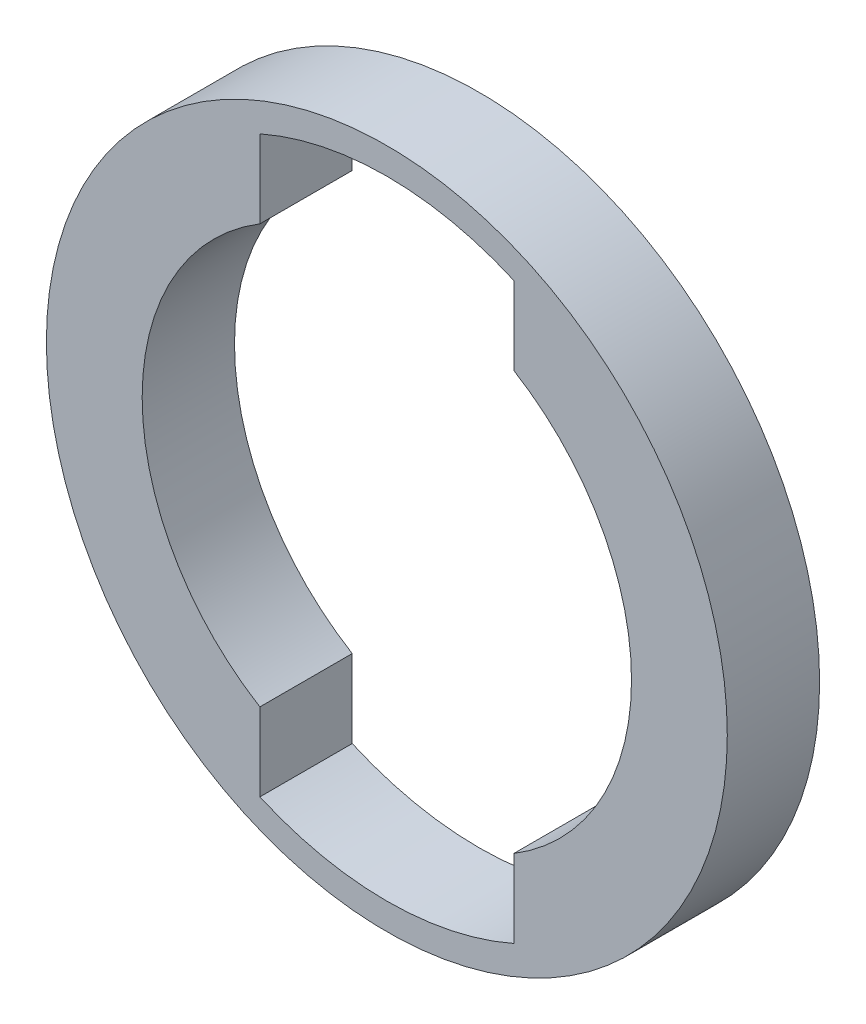
ISO-10303-21;
HEADER;
FILE_DESCRIPTION(('STEP AP214'),'2;1');
FILE_NAME('part.step','',(''),(''),'','','');
FILE_SCHEMA(('AUTOMOTIVE_DESIGN { 1 0 10303 214 1 1 1 1 }'));
ENDSEC;
DATA;
#1=APPLICATION_CONTEXT('core data for automotive mechanical design processes');
#2=APPLICATION_PROTOCOL_DEFINITION('international standard','automotive_design',2000,#1);
#3=PRODUCT_CONTEXT('',#1,'mechanical');
#4=PRODUCT('Part','Part','',(#3));
#5=PRODUCT_RELATED_PRODUCT_CATEGORY('part','',(#4));
#6=PRODUCT_DEFINITION_FORMATION('','',#4);
#7=PRODUCT_DEFINITION_CONTEXT('part definition',#1,'design');
#8=PRODUCT_DEFINITION('design','',#6,#7);
#9=PRODUCT_DEFINITION_SHAPE('','',#8);
#10=(LENGTH_UNIT() NAMED_UNIT(*) SI_UNIT(.MILLI.,.METRE.));
#11=(NAMED_UNIT(*) PLANE_ANGLE_UNIT() SI_UNIT($,.RADIAN.));
#12=(NAMED_UNIT(*) SI_UNIT($,.STERADIAN.) SOLID_ANGLE_UNIT());
#13=UNCERTAINTY_MEASURE_WITH_UNIT(LENGTH_MEASURE(1.E-05),#10,'distance_accuracy_value','');
#14=(GEOMETRIC_REPRESENTATION_CONTEXT(3) GLOBAL_UNCERTAINTY_ASSIGNED_CONTEXT((#13)) GLOBAL_UNIT_ASSIGNED_CONTEXT((#10,
#11,#12)) REPRESENTATION_CONTEXT('',''));
#15=CARTESIAN_POINT('',(0.,0.,0.));
#16=DIRECTION('',(0.,0.,1.));
#17=DIRECTION('',(1.,0.,0.));
#18=AXIS2_PLACEMENT_3D('',#15,#16,#17);
#19=CARTESIAN_POINT('',(0.,0.,-2.));
#20=DIRECTION('',(0.,0.,1.));
#21=DIRECTION('',(1.,0.,0.));
#22=AXIS2_PLACEMENT_3D('',#19,#20,#21);
#23=CYLINDRICAL_SURFACE('',#22,7.375);
#24=CARTESIAN_POINT('',(0.,0.,-2.));
#25=DIRECTION('',(0.,0.,1.));
#26=DIRECTION('',(1.,0.,0.));
#27=AXIS2_PLACEMENT_3D('',#24,#25,#26);
#28=CIRCLE('',#27,7.375);
#29=CARTESIAN_POINT('',(7.375,0.,-2.));
#30=VERTEX_POINT('',#29);
#31=EDGE_CURVE('E11',#30,#30,#28,.T.);
#32=ORIENTED_EDGE('',*,*,#31,.T.);
#33=EDGE_LOOP('',(#32));
#34=FACE_BOUND('',#33,.T.);
#35=CARTESIAN_POINT('',(0.,0.,0.));
#36=DIRECTION('',(0.,0.,1.));
#37=DIRECTION('',(1.,0.,0.));
#38=AXIS2_PLACEMENT_3D('',#35,#36,#37);
#39=CIRCLE('',#38,7.375);
#40=CARTESIAN_POINT('',(7.375,0.,0.));
#41=VERTEX_POINT('',#40);
#42=EDGE_CURVE('E48',#41,#41,#39,.T.);
#43=ORIENTED_EDGE('',*,*,#42,.F.);
#44=EDGE_LOOP('',(#43));
#45=FACE_BOUND('',#44,.T.);
#46=ADVANCED_FACE('F45',(#34,#45),#23,.T.);
#47=CARTESIAN_POINT('',(0.,0.,-2.));
#48=DIRECTION('',(0.,0.,1.));
#49=DIRECTION('',(1.,0.,0.));
#50=AXIS2_PLACEMENT_3D('',#47,#48,#49);
#51=PLANE('',#50);
#52=DIRECTION('',(0.,1.,0.));
#53=VECTOR('',#52,1.);
#54=CARTESIAN_POINT('',(2.75,6.21912373248836,-2.));
#55=LINE('',#54,#53);
#56=CARTESIAN_POINT('',(2.75,4.53072841825683,-2.));
#57=VERTEX_POINT('',#56);
#58=CARTESIAN_POINT('',(2.75,6.21912373248836,-2.));
#59=VERTEX_POINT('',#58);
#60=EDGE_CURVE('E119',#57,#59,#55,.T.);
#61=ORIENTED_EDGE('',*,*,#60,.T.);
#62=CARTESIAN_POINT('',(0.,0.,-2.));
#63=DIRECTION('',(0.,0.,1.));
#64=DIRECTION('',(1.,0.,0.));
#65=AXIS2_PLACEMENT_3D('',#62,#63,#64);
#66=CIRCLE('',#65,6.8);
#67=CARTESIAN_POINT('',(-2.75,6.21912373248836,-2.));
#68=VERTEX_POINT('',#67);
#69=EDGE_CURVE('E112',#59,#68,#66,.T.);
#70=ORIENTED_EDGE('',*,*,#69,.T.);
#71=DIRECTION('',(0.,-1.,0.));
#72=VECTOR('',#71,1.);
#73=CARTESIAN_POINT('',(-2.75,6.21912373248836,-2.));
#74=LINE('',#73,#72);
#75=CARTESIAN_POINT('',(-2.75,4.53072841825683,-2.));
#76=VERTEX_POINT('',#75);
#77=EDGE_CURVE('E122',#68,#76,#74,.T.);
#78=ORIENTED_EDGE('',*,*,#77,.T.);
#79=CARTESIAN_POINT('',(0.,0.,-2.));
#80=DIRECTION('',(0.,0.,1.));
#81=DIRECTION('',(1.,0.,0.));
#82=AXIS2_PLACEMENT_3D('',#79,#80,#81);
#83=CIRCLE('',#82,5.3);
#84=CARTESIAN_POINT('',(-2.75,-4.53072841825682,-2.));
#85=VERTEX_POINT('',#84);
#86=EDGE_CURVE('E60',#76,#85,#83,.T.);
#87=ORIENTED_EDGE('',*,*,#86,.T.);
#88=DIRECTION('',(0.,-1.,0.));
#89=VECTOR('',#88,1.);
#90=CARTESIAN_POINT('',(-2.75,-6.21912373248836,-2.));
#91=LINE('',#90,#89);
#92=CARTESIAN_POINT('',(-2.75,-6.21912373248836,-2.));
#93=VERTEX_POINT('',#92);
#94=EDGE_CURVE('E141',#85,#93,#91,.T.);
#95=ORIENTED_EDGE('',*,*,#94,.T.);
#96=CARTESIAN_POINT('',(0.,0.,-2.));
#97=DIRECTION('',(0.,0.,1.));
#98=DIRECTION('',(1.,0.,0.));
#99=AXIS2_PLACEMENT_3D('',#96,#97,#98);
#100=CIRCLE('',#99,6.8);
#101=CARTESIAN_POINT('',(2.75,-6.21912373248836,-2.));
#102=VERTEX_POINT('',#101);
#103=EDGE_CURVE('E145',#93,#102,#100,.T.);
#104=ORIENTED_EDGE('',*,*,#103,.T.);
#105=DIRECTION('',(0.,1.,0.));
#106=VECTOR('',#105,1.);
#107=CARTESIAN_POINT('',(2.75,-6.21912373248836,-2.));
#108=LINE('',#107,#106);
#109=CARTESIAN_POINT('',(2.75,-4.53072841825683,-2.));
#110=VERTEX_POINT('',#109);
#111=EDGE_CURVE('E149',#102,#110,#108,.T.);
#112=ORIENTED_EDGE('',*,*,#111,.T.);
#113=CARTESIAN_POINT('',(0.,0.,-2.));
#114=DIRECTION('',(0.,0.,1.));
#115=DIRECTION('',(1.,0.,0.));
#116=AXIS2_PLACEMENT_3D('',#113,#114,#115);
#117=CIRCLE('',#116,5.3);
#118=EDGE_CURVE('E153',#110,#57,#117,.T.);
#119=ORIENTED_EDGE('',*,*,#118,.T.);
#120=EDGE_LOOP('',(#61,#70,#78,#87,#95,#104,#112,#119));
#121=FACE_BOUND('',#120,.T.);
#122=ORIENTED_EDGE('',*,*,#31,.F.);
#123=EDGE_LOOP('',(#122));
#124=FACE_BOUND('',#123,.T.);
#125=ADVANCED_FACE('F127',(#121,#124),#51,.F.);
#126=CARTESIAN_POINT('',(0.,0.,0.));
#127=DIRECTION('',(0.,0.,1.));
#128=DIRECTION('',(1.,0.,0.));
#129=AXIS2_PLACEMENT_3D('',#126,#127,#128);
#130=PLANE('',#129);
#131=CARTESIAN_POINT('',(0.,0.,0.));
#132=DIRECTION('',(0.,0.,1.));
#133=DIRECTION('',(1.,0.,0.));
#134=AXIS2_PLACEMENT_3D('',#131,#132,#133);
#135=CIRCLE('',#134,6.8);
#136=CARTESIAN_POINT('',(2.75,6.21912373248836,0.));
#137=VERTEX_POINT('',#136);
#138=CARTESIAN_POINT('',(-2.75,6.21912373248836,0.));
#139=VERTEX_POINT('',#138);
#140=EDGE_CURVE('E68',#137,#139,#135,.T.);
#141=ORIENTED_EDGE('',*,*,#140,.F.);
#142=DIRECTION('',(0.,1.,0.));
#143=VECTOR('',#142,1.);
#144=CARTESIAN_POINT('',(2.75,6.21912373248836,0.));
#145=LINE('',#144,#143);
#146=CARTESIAN_POINT('',(2.75,4.53072841825683,0.));
#147=VERTEX_POINT('',#146);
#148=EDGE_CURVE('E132',#147,#137,#145,.T.);
#149=ORIENTED_EDGE('',*,*,#148,.F.);
#150=CARTESIAN_POINT('',(0.,0.,0.));
#151=DIRECTION('',(0.,0.,1.));
#152=DIRECTION('',(1.,0.,0.));
#153=AXIS2_PLACEMENT_3D('',#150,#151,#152);
#154=CIRCLE('',#153,5.3);
#155=CARTESIAN_POINT('',(2.75,-4.53072841825683,0.));
#156=VERTEX_POINT('',#155);
#157=EDGE_CURVE('E136',#156,#147,#154,.T.);
#158=ORIENTED_EDGE('',*,*,#157,.F.);
#159=DIRECTION('',(0.,1.,0.));
#160=VECTOR('',#159,1.);
#161=CARTESIAN_POINT('',(2.75,-6.21912373248836,0.));
#162=LINE('',#161,#160);
#163=CARTESIAN_POINT('',(2.75,-6.21912373248836,0.));
#164=VERTEX_POINT('',#163);
#165=EDGE_CURVE('E175',#164,#156,#162,.T.);
#166=ORIENTED_EDGE('',*,*,#165,.F.);
#167=CARTESIAN_POINT('',(0.,0.,0.));
#168=DIRECTION('',(0.,0.,1.));
#169=DIRECTION('',(1.,0.,0.));
#170=AXIS2_PLACEMENT_3D('',#167,#168,#169);
#171=CIRCLE('',#170,6.8);
#172=CARTESIAN_POINT('',(-2.75,-6.21912373248836,0.));
#173=VERTEX_POINT('',#172);
#174=EDGE_CURVE('E171',#173,#164,#171,.T.);
#175=ORIENTED_EDGE('',*,*,#174,.F.);
#176=DIRECTION('',(0.,-1.,0.));
#177=VECTOR('',#176,1.);
#178=CARTESIAN_POINT('',(-2.75,-6.21912373248836,0.));
#179=LINE('',#178,#177);
#180=CARTESIAN_POINT('',(-2.75,-4.53072841825682,0.));
#181=VERTEX_POINT('',#180);
#182=EDGE_CURVE('E167',#181,#173,#179,.T.);
#183=ORIENTED_EDGE('',*,*,#182,.F.);
#184=CARTESIAN_POINT('',(0.,0.,0.));
#185=DIRECTION('',(0.,0.,1.));
#186=DIRECTION('',(1.,0.,0.));
#187=AXIS2_PLACEMENT_3D('',#184,#185,#186);
#188=CIRCLE('',#187,5.3);
#189=CARTESIAN_POINT('',(-2.75,4.53072841825683,0.));
#190=VERTEX_POINT('',#189);
#191=EDGE_CURVE('E163',#190,#181,#188,.T.);
#192=ORIENTED_EDGE('',*,*,#191,.F.);
#193=DIRECTION('',(0.,-1.,0.));
#194=VECTOR('',#193,1.);
#195=CARTESIAN_POINT('',(-2.75,6.21912373248836,0.));
#196=LINE('',#195,#194);
#197=EDGE_CURVE('E160',#139,#190,#196,.T.);
#198=ORIENTED_EDGE('',*,*,#197,.F.);
#199=EDGE_LOOP('',(#141,#149,#158,#166,#175,#183,#192,#198));
#200=FACE_BOUND('',#199,.T.);
#201=ORIENTED_EDGE('',*,*,#42,.T.);
#202=EDGE_LOOP('',(#201));
#203=FACE_BOUND('',#202,.T.);
#204=ADVANCED_FACE('F205',(#200,#203),#130,.T.);
#205=CARTESIAN_POINT('',(0.,0.,-2.));
#206=DIRECTION('',(0.,0.,1.));
#207=DIRECTION('',(1.,0.,0.));
#208=AXIS2_PLACEMENT_3D('',#205,#206,#207);
#209=CYLINDRICAL_SURFACE('',#208,6.8);
#210=ORIENTED_EDGE('',*,*,#140,.T.);
#211=DIRECTION('',(0.,0.,1.));
#212=VECTOR('',#211,1.);
#213=CARTESIAN_POINT('',(-2.75,6.21912373248836,-2.));
#214=LINE('',#213,#212);
#215=EDGE_CURVE('E108',#68,#139,#214,.T.);
#216=ORIENTED_EDGE('',*,*,#215,.F.);
#217=ORIENTED_EDGE('',*,*,#69,.F.);
#218=DIRECTION('',(0.,0.,1.));
#219=VECTOR('',#218,1.);
#220=CARTESIAN_POINT('',(2.75,6.21912373248836,-2.));
#221=LINE('',#220,#219);
#222=EDGE_CURVE('E182',#59,#137,#221,.T.);
#223=ORIENTED_EDGE('',*,*,#222,.T.);
#224=EDGE_LOOP('',(#210,#216,#217,#223));
#225=FACE_BOUND('',#224,.T.);
#226=ADVANCED_FACE('F110',(#225),#209,.F.);
#227=CARTESIAN_POINT('',(2.75,6.21912373248836,-2.));
#228=DIRECTION('',(1.,0.,0.));
#229=DIRECTION('',(0.,1.,0.));
#230=AXIS2_PLACEMENT_3D('',#227,#228,#229);
#231=PLANE('',#230);
#232=ORIENTED_EDGE('',*,*,#148,.T.);
#233=ORIENTED_EDGE('',*,*,#222,.F.);
#234=ORIENTED_EDGE('',*,*,#60,.F.);
#235=DIRECTION('',(0.,0.,1.));
#236=VECTOR('',#235,1.);
#237=CARTESIAN_POINT('',(2.75,4.53072841825683,-2.));
#238=LINE('',#237,#236);
#239=EDGE_CURVE('E185',#57,#147,#238,.T.);
#240=ORIENTED_EDGE('',*,*,#239,.T.);
#241=EDGE_LOOP('',(#232,#233,#234,#240));
#242=FACE_BOUND('',#241,.T.);
#243=ADVANCED_FACE('F224',(#242),#231,.F.);
#244=CARTESIAN_POINT('',(0.,0.,-2.));
#245=DIRECTION('',(0.,0.,1.));
#246=DIRECTION('',(1.,0.,0.));
#247=AXIS2_PLACEMENT_3D('',#244,#245,#246);
#248=CYLINDRICAL_SURFACE('',#247,5.3);
#249=ORIENTED_EDGE('',*,*,#157,.T.);
#250=ORIENTED_EDGE('',*,*,#239,.F.);
#251=ORIENTED_EDGE('',*,*,#118,.F.);
#252=DIRECTION('',(0.,0.,1.));
#253=VECTOR('',#252,1.);
#254=CARTESIAN_POINT('',(2.75,-4.53072841825683,-2.));
#255=LINE('',#254,#253);
#256=EDGE_CURVE('E188',#110,#156,#255,.T.);
#257=ORIENTED_EDGE('',*,*,#256,.T.);
#258=EDGE_LOOP('',(#249,#250,#251,#257));
#259=FACE_BOUND('',#258,.T.);
#260=ADVANCED_FACE('F221',(#259),#248,.F.);
#261=CARTESIAN_POINT('',(2.75,-6.21912373248836,-2.));
#262=DIRECTION('',(1.,0.,0.));
#263=DIRECTION('',(0.,0.,-1.));
#264=AXIS2_PLACEMENT_3D('',#261,#262,#263);
#265=PLANE('',#264);
#266=ORIENTED_EDGE('',*,*,#165,.T.);
#267=ORIENTED_EDGE('',*,*,#256,.F.);
#268=ORIENTED_EDGE('',*,*,#111,.F.);
#269=DIRECTION('',(0.,0.,1.));
#270=VECTOR('',#269,1.);
#271=CARTESIAN_POINT('',(2.75,-6.21912373248836,-2.));
#272=LINE('',#271,#270);
#273=EDGE_CURVE('E191',#102,#164,#272,.T.);
#274=ORIENTED_EDGE('',*,*,#273,.T.);
#275=EDGE_LOOP('',(#266,#267,#268,#274));
#276=FACE_BOUND('',#275,.T.);
#277=ADVANCED_FACE('F217',(#276),#265,.F.);
#278=CARTESIAN_POINT('',(0.,0.,-2.));
#279=DIRECTION('',(0.,0.,1.));
#280=DIRECTION('',(1.,0.,0.));
#281=AXIS2_PLACEMENT_3D('',#278,#279,#280);
#282=CYLINDRICAL_SURFACE('',#281,6.8);
#283=ORIENTED_EDGE('',*,*,#174,.T.);
#284=ORIENTED_EDGE('',*,*,#273,.F.);
#285=ORIENTED_EDGE('',*,*,#103,.F.);
#286=DIRECTION('',(0.,0.,1.));
#287=VECTOR('',#286,1.);
#288=CARTESIAN_POINT('',(-2.75,-6.21912373248836,-2.));
#289=LINE('',#288,#287);
#290=EDGE_CURVE('E194',#93,#173,#289,.T.);
#291=ORIENTED_EDGE('',*,*,#290,.T.);
#292=EDGE_LOOP('',(#283,#284,#285,#291));
#293=FACE_BOUND('',#292,.T.);
#294=ADVANCED_FACE('F215',(#293),#282,.F.);
#295=CARTESIAN_POINT('',(-2.75,-6.21912373248836,-2.));
#296=DIRECTION('',(-1.,0.,0.));
#297=DIRECTION('',(0.,0.,1.));
#298=AXIS2_PLACEMENT_3D('',#295,#296,#297);
#299=PLANE('',#298);
#300=ORIENTED_EDGE('',*,*,#182,.T.);
#301=ORIENTED_EDGE('',*,*,#290,.F.);
#302=ORIENTED_EDGE('',*,*,#94,.F.);
#303=DIRECTION('',(0.,0.,1.));
#304=VECTOR('',#303,1.);
#305=CARTESIAN_POINT('',(-2.75,-4.53072841825682,-2.));
#306=LINE('',#305,#304);
#307=EDGE_CURVE('E197',#85,#181,#306,.T.);
#308=ORIENTED_EDGE('',*,*,#307,.T.);
#309=EDGE_LOOP('',(#300,#301,#302,#308));
#310=FACE_BOUND('',#309,.T.);
#311=ADVANCED_FACE('F210',(#310),#299,.F.);
#312=CARTESIAN_POINT('',(0.,0.,-2.));
#313=DIRECTION('',(0.,0.,1.));
#314=DIRECTION('',(1.,0.,0.));
#315=AXIS2_PLACEMENT_3D('',#312,#313,#314);
#316=CYLINDRICAL_SURFACE('',#315,5.3);
#317=ORIENTED_EDGE('',*,*,#191,.T.);
#318=ORIENTED_EDGE('',*,*,#307,.F.);
#319=ORIENTED_EDGE('',*,*,#86,.F.);
#320=DIRECTION('',(0.,0.,1.));
#321=VECTOR('',#320,1.);
#322=CARTESIAN_POINT('',(-2.75,4.53072841825683,-2.));
#323=LINE('',#322,#321);
#324=EDGE_CURVE('E118',#76,#190,#323,.T.);
#325=ORIENTED_EDGE('',*,*,#324,.T.);
#326=EDGE_LOOP('',(#317,#318,#319,#325));
#327=FACE_BOUND('',#326,.T.);
#328=ADVANCED_FACE('F201',(#327),#316,.F.);
#329=CARTESIAN_POINT('',(-2.75,6.21912373248836,-2.));
#330=DIRECTION('',(-1.,0.,0.));
#331=DIRECTION('',(0.,-1.,0.));
#332=AXIS2_PLACEMENT_3D('',#329,#330,#331);
#333=PLANE('',#332);
#334=ORIENTED_EDGE('',*,*,#197,.T.);
#335=ORIENTED_EDGE('',*,*,#324,.F.);
#336=ORIENTED_EDGE('',*,*,#77,.F.);
#337=ORIENTED_EDGE('',*,*,#215,.T.);
#338=EDGE_LOOP('',(#334,#335,#336,#337));
#339=FACE_BOUND('',#338,.T.);
#340=ADVANCED_FACE('F123',(#339),#333,.F.);
#341=CLOSED_SHELL('',(#46,#125,#204,#226,#243,#260,#277,#294,#311,#328,#340));
#342=MANIFOLD_SOLID_BREP('B2',#341);
#343=ADVANCED_BREP_SHAPE_REPRESENTATION('',(#18,#342),#14);
#344=SHAPE_DEFINITION_REPRESENTATION(#9,#343);
ENDSEC;
END-ISO-10303-21;
